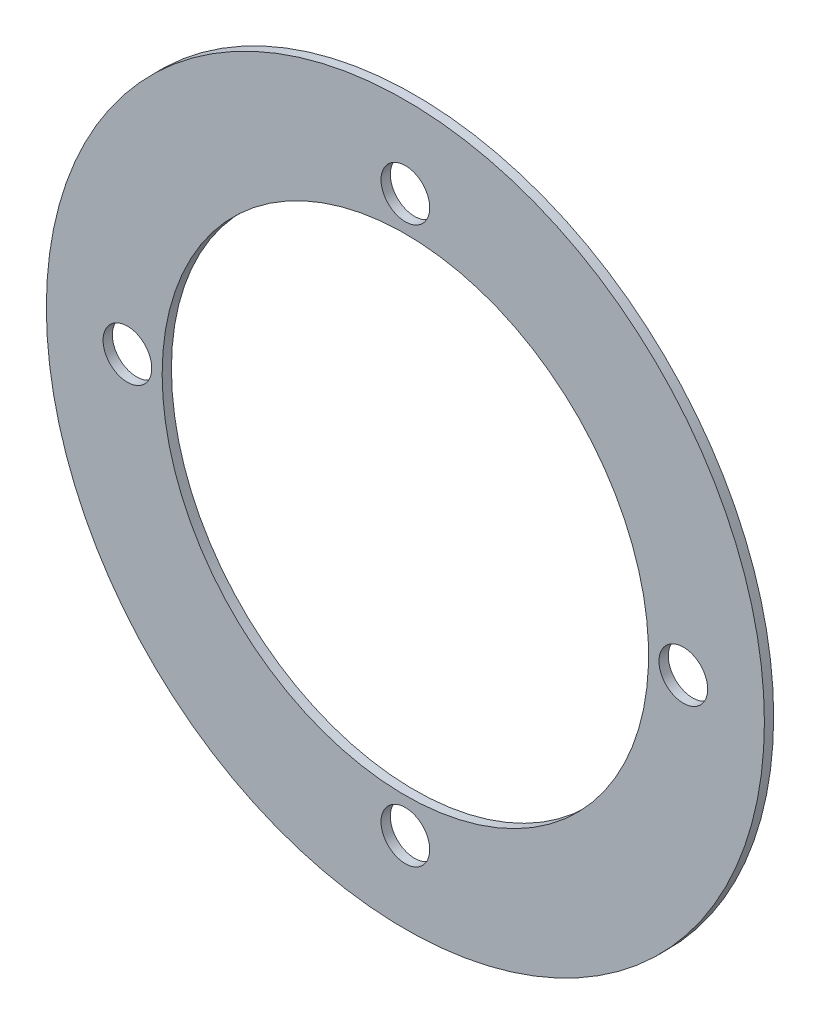
ISO-10303-21;
HEADER;
FILE_DESCRIPTION(('STEP AP214'),'2;1');
FILE_NAME('part.step','',(''),(''),'','','');
FILE_SCHEMA(('AUTOMOTIVE_DESIGN { 1 0 10303 214 1 1 1 1 }'));
ENDSEC;
DATA;
#1=APPLICATION_CONTEXT('core data for automotive mechanical design processes');
#2=APPLICATION_PROTOCOL_DEFINITION('international standard','automotive_design',2000,#1);
#3=PRODUCT_CONTEXT('',#1,'mechanical');
#4=PRODUCT('Part','Part','',(#3));
#5=PRODUCT_RELATED_PRODUCT_CATEGORY('part','',(#4));
#6=PRODUCT_DEFINITION_FORMATION('','',#4);
#7=PRODUCT_DEFINITION_CONTEXT('part definition',#1,'design');
#8=PRODUCT_DEFINITION('design','',#6,#7);
#9=PRODUCT_DEFINITION_SHAPE('','',#8);
#10=(LENGTH_UNIT() NAMED_UNIT(*) SI_UNIT(.MILLI.,.METRE.));
#11=(NAMED_UNIT(*) PLANE_ANGLE_UNIT() SI_UNIT($,.RADIAN.));
#12=(NAMED_UNIT(*) SI_UNIT($,.STERADIAN.) SOLID_ANGLE_UNIT());
#13=UNCERTAINTY_MEASURE_WITH_UNIT(LENGTH_MEASURE(1.E-05),#10,'distance_accuracy_value','');
#14=(GEOMETRIC_REPRESENTATION_CONTEXT(3) GLOBAL_UNCERTAINTY_ASSIGNED_CONTEXT((#13)) GLOBAL_UNIT_ASSIGNED_CONTEXT((#10,
#11,#12)) REPRESENTATION_CONTEXT('',''));
#15=CARTESIAN_POINT('',(0.,0.,0.));
#16=DIRECTION('',(0.,0.,1.));
#17=DIRECTION('',(1.,0.,0.));
#18=AXIS2_PLACEMENT_3D('',#15,#16,#17);
#19=CARTESIAN_POINT('',(0.,0.,0.8));
#20=DIRECTION('',(0.,0.,1.));
#21=DIRECTION('',(1.,0.,0.));
#22=AXIS2_PLACEMENT_3D('',#19,#20,#21);
#23=PLANE('',#22);
#24=CARTESIAN_POINT('',(-24.,2.51386801999876E-13,0.8));
#25=DIRECTION('',(0.,0.,-1.));
#26=DIRECTION('',(-1.,0.,0.));
#27=AXIS2_PLACEMENT_3D('',#24,#25,#26);
#28=CIRCLE('',#27,2.1);
#29=CARTESIAN_POINT('',(-26.1,2.51386801999876E-13,0.8));
#30=VERTEX_POINT('',#29);
#31=EDGE_CURVE('E41',#30,#30,#28,.T.);
#32=ORIENTED_EDGE('',*,*,#31,.T.);
#33=EDGE_LOOP('',(#32));
#34=FACE_BOUND('',#33,.T.);
#35=CARTESIAN_POINT('',(24.,0.,0.8));
#36=DIRECTION('',(0.,0.,-1.));
#37=DIRECTION('',(-1.,0.,0.));
#38=AXIS2_PLACEMENT_3D('',#35,#36,#37);
#39=CIRCLE('',#38,2.1);
#40=CARTESIAN_POINT('',(21.9,0.,0.8));
#41=VERTEX_POINT('',#40);
#42=EDGE_CURVE('E44',#41,#41,#39,.T.);
#43=ORIENTED_EDGE('',*,*,#42,.T.);
#44=EDGE_LOOP('',(#43));
#45=FACE_BOUND('',#44,.T.);
#46=CARTESIAN_POINT('',(0.,24.,0.8));
#47=DIRECTION('',(0.,0.,-1.));
#48=DIRECTION('',(-1.,0.,0.));
#49=AXIS2_PLACEMENT_3D('',#46,#47,#48);
#50=CIRCLE('',#49,2.1);
#51=CARTESIAN_POINT('',(-2.1,24.,0.8));
#52=VERTEX_POINT('',#51);
#53=EDGE_CURVE('E47',#52,#52,#50,.T.);
#54=ORIENTED_EDGE('',*,*,#53,.T.);
#55=EDGE_LOOP('',(#54));
#56=FACE_BOUND('',#55,.T.);
#57=CARTESIAN_POINT('',(0.,0.,0.8));
#58=DIRECTION('',(0.,0.,-1.));
#59=DIRECTION('',(-1.,0.,0.));
#60=AXIS2_PLACEMENT_3D('',#57,#58,#59);
#61=CIRCLE('',#60,31.);
#62=CARTESIAN_POINT('',(-31.,0.,0.8));
#63=VERTEX_POINT('',#62);
#64=EDGE_CURVE('E50',#63,#63,#61,.T.);
#65=ORIENTED_EDGE('',*,*,#64,.F.);
#66=EDGE_LOOP('',(#65));
#67=FACE_BOUND('',#66,.T.);
#68=CARTESIAN_POINT('',(0.,0.,0.8));
#69=DIRECTION('',(0.,0.,-1.));
#70=DIRECTION('',(-1.,0.,0.));
#71=AXIS2_PLACEMENT_3D('',#68,#69,#70);
#72=CIRCLE('',#71,21.);
#73=CARTESIAN_POINT('',(-21.,0.,0.8));
#74=VERTEX_POINT('',#73);
#75=EDGE_CURVE('E52',#74,#74,#72,.T.);
#76=ORIENTED_EDGE('',*,*,#75,.T.);
#77=EDGE_LOOP('',(#76));
#78=FACE_BOUND('',#77,.T.);
#79=CARTESIAN_POINT('',(6.76243012900129E-13,-24.,0.8));
#80=DIRECTION('',(0.,0.,-1.));
#81=DIRECTION('',(-1.,0.,0.));
#82=AXIS2_PLACEMENT_3D('',#79,#80,#81);
#83=CIRCLE('',#82,2.10000000000081);
#84=CARTESIAN_POINT('',(-2.10000000000013,-24.,0.8));
#85=VERTEX_POINT('',#84);
#86=EDGE_CURVE('E18',#85,#85,#83,.T.);
#87=ORIENTED_EDGE('',*,*,#86,.T.);
#88=EDGE_LOOP('',(#87));
#89=FACE_BOUND('',#88,.T.);
#90=ADVANCED_FACE('F15',(#34,#45,#56,#67,#78,#89),#23,.T.);
#91=CARTESIAN_POINT('',(6.76243012900129E-13,-24.,0.8));
#92=DIRECTION('',(0.,0.,-1.));
#93=DIRECTION('',(-1.,0.,0.));
#94=AXIS2_PLACEMENT_3D('',#91,#92,#93);
#95=CYLINDRICAL_SURFACE('',#94,2.10000000000081);
#96=CARTESIAN_POINT('',(6.76243012900129E-13,-24.,0.));
#97=DIRECTION('',(0.,0.,-1.));
#98=DIRECTION('',(-1.,0.,0.));
#99=AXIS2_PLACEMENT_3D('',#96,#97,#98);
#100=CIRCLE('',#99,2.10000000000081);
#101=CARTESIAN_POINT('',(-2.10000000000013,-24.,0.));
#102=VERTEX_POINT('',#101);
#103=EDGE_CURVE('E38',#102,#102,#100,.T.);
#104=ORIENTED_EDGE('',*,*,#103,.T.);
#105=EDGE_LOOP('',(#104));
#106=FACE_BOUND('',#105,.T.);
#107=ORIENTED_EDGE('',*,*,#86,.F.);
#108=EDGE_LOOP('',(#107));
#109=FACE_BOUND('',#108,.T.);
#110=ADVANCED_FACE('F60',(#106,#109),#95,.F.);
#111=CARTESIAN_POINT('',(0.,0.,0.8));
#112=DIRECTION('',(0.,0.,-1.));
#113=DIRECTION('',(-1.,0.,0.));
#114=AXIS2_PLACEMENT_3D('',#111,#112,#113);
#115=CYLINDRICAL_SURFACE('',#114,21.);
#116=CARTESIAN_POINT('',(0.,0.,0.));
#117=DIRECTION('',(0.,0.,-1.));
#118=DIRECTION('',(-1.,0.,0.));
#119=AXIS2_PLACEMENT_3D('',#116,#117,#118);
#120=CIRCLE('',#119,21.);
#121=CARTESIAN_POINT('',(-21.,0.,0.));
#122=VERTEX_POINT('',#121);
#123=EDGE_CURVE('E35',#122,#122,#120,.T.);
#124=ORIENTED_EDGE('',*,*,#123,.T.);
#125=EDGE_LOOP('',(#124));
#126=FACE_BOUND('',#125,.T.);
#127=ORIENTED_EDGE('',*,*,#75,.F.);
#128=EDGE_LOOP('',(#127));
#129=FACE_BOUND('',#128,.T.);
#130=ADVANCED_FACE('F62',(#126,#129),#115,.F.);
#131=CARTESIAN_POINT('',(0.,0.,0.8));
#132=DIRECTION('',(0.,0.,-1.));
#133=DIRECTION('',(-1.,0.,0.));
#134=AXIS2_PLACEMENT_3D('',#131,#132,#133);
#135=CYLINDRICAL_SURFACE('',#134,31.);
#136=ORIENTED_EDGE('',*,*,#64,.T.);
#137=EDGE_LOOP('',(#136));
#138=FACE_BOUND('',#137,.T.);
#139=CARTESIAN_POINT('',(0.,0.,0.));
#140=DIRECTION('',(0.,0.,-1.));
#141=DIRECTION('',(-1.,0.,0.));
#142=AXIS2_PLACEMENT_3D('',#139,#140,#141);
#143=CIRCLE('',#142,31.);
#144=CARTESIAN_POINT('',(-31.,0.,0.));
#145=VERTEX_POINT('',#144);
#146=EDGE_CURVE('E32',#145,#145,#143,.F.);
#147=ORIENTED_EDGE('',*,*,#146,.T.);
#148=EDGE_LOOP('',(#147));
#149=FACE_BOUND('',#148,.T.);
#150=ADVANCED_FACE('F69',(#138,#149),#135,.T.);
#151=CARTESIAN_POINT('',(0.,24.,0.8));
#152=DIRECTION('',(0.,0.,-1.));
#153=DIRECTION('',(-1.,0.,0.));
#154=AXIS2_PLACEMENT_3D('',#151,#152,#153);
#155=CYLINDRICAL_SURFACE('',#154,2.1);
#156=CARTESIAN_POINT('',(0.,24.,0.));
#157=DIRECTION('',(0.,0.,-1.));
#158=DIRECTION('',(-1.,0.,0.));
#159=AXIS2_PLACEMENT_3D('',#156,#157,#158);
#160=CIRCLE('',#159,2.1);
#161=CARTESIAN_POINT('',(-2.1,24.,0.));
#162=VERTEX_POINT('',#161);
#163=EDGE_CURVE('E27',#162,#162,#160,.T.);
#164=ORIENTED_EDGE('',*,*,#163,.T.);
#165=EDGE_LOOP('',(#164));
#166=FACE_BOUND('',#165,.T.);
#167=ORIENTED_EDGE('',*,*,#53,.F.);
#168=EDGE_LOOP('',(#167));
#169=FACE_BOUND('',#168,.T.);
#170=ADVANCED_FACE('F87',(#166,#169),#155,.F.);
#171=CARTESIAN_POINT('',(24.,0.,0.8));
#172=DIRECTION('',(0.,0.,-1.));
#173=DIRECTION('',(-1.,0.,0.));
#174=AXIS2_PLACEMENT_3D('',#171,#172,#173);
#175=CYLINDRICAL_SURFACE('',#174,2.1);
#176=CARTESIAN_POINT('',(24.,0.,0.));
#177=DIRECTION('',(0.,0.,-1.));
#178=DIRECTION('',(-1.,0.,0.));
#179=AXIS2_PLACEMENT_3D('',#176,#177,#178);
#180=CIRCLE('',#179,2.1);
#181=CARTESIAN_POINT('',(21.9,0.,0.));
#182=VERTEX_POINT('',#181);
#183=EDGE_CURVE('E22',#182,#182,#180,.T.);
#184=ORIENTED_EDGE('',*,*,#183,.T.);
#185=EDGE_LOOP('',(#184));
#186=FACE_BOUND('',#185,.T.);
#187=ORIENTED_EDGE('',*,*,#42,.F.);
#188=EDGE_LOOP('',(#187));
#189=FACE_BOUND('',#188,.T.);
#190=ADVANCED_FACE('F81',(#186,#189),#175,.F.);
#191=CARTESIAN_POINT('',(-24.,2.51386801999876E-13,0.8));
#192=DIRECTION('',(0.,0.,-1.));
#193=DIRECTION('',(-1.,0.,0.));
#194=AXIS2_PLACEMENT_3D('',#191,#192,#193);
#195=CYLINDRICAL_SURFACE('',#194,2.1);
#196=CARTESIAN_POINT('',(-24.,2.51386801999876E-13,0.));
#197=DIRECTION('',(0.,0.,-1.));
#198=DIRECTION('',(-1.,0.,0.));
#199=AXIS2_PLACEMENT_3D('',#196,#197,#198);
#200=CIRCLE('',#199,2.1);
#201=CARTESIAN_POINT('',(-26.1,2.51386801999876E-13,0.));
#202=VERTEX_POINT('',#201);
#203=EDGE_CURVE('E9',#202,#202,#200,.T.);
#204=ORIENTED_EDGE('',*,*,#203,.T.);
#205=EDGE_LOOP('',(#204));
#206=FACE_BOUND('',#205,.T.);
#207=ORIENTED_EDGE('',*,*,#31,.F.);
#208=EDGE_LOOP('',(#207));
#209=FACE_BOUND('',#208,.T.);
#210=ADVANCED_FACE('F75',(#206,#209),#195,.F.);
#211=CARTESIAN_POINT('',(0.,0.,0.));
#212=DIRECTION('',(0.,0.,1.));
#213=DIRECTION('',(1.,0.,0.));
#214=AXIS2_PLACEMENT_3D('',#211,#212,#213);
#215=PLANE('',#214);
#216=ORIENTED_EDGE('',*,*,#203,.F.);
#217=EDGE_LOOP('',(#216));
#218=FACE_BOUND('',#217,.T.);
#219=ORIENTED_EDGE('',*,*,#183,.F.);
#220=EDGE_LOOP('',(#219));
#221=FACE_BOUND('',#220,.T.);
#222=ORIENTED_EDGE('',*,*,#163,.F.);
#223=EDGE_LOOP('',(#222));
#224=FACE_BOUND('',#223,.T.);
#225=ORIENTED_EDGE('',*,*,#146,.F.);
#226=EDGE_LOOP('',(#225));
#227=FACE_BOUND('',#226,.T.);
#228=ORIENTED_EDGE('',*,*,#123,.F.);
#229=EDGE_LOOP('',(#228));
#230=FACE_BOUND('',#229,.T.);
#231=ORIENTED_EDGE('',*,*,#103,.F.);
#232=EDGE_LOOP('',(#231));
#233=FACE_BOUND('',#232,.T.);
#234=ADVANCED_FACE('F73',(#218,#221,#224,#227,#230,#233),#215,.F.);
#235=CLOSED_SHELL('',(#90,#110,#130,#150,#170,#190,#210,#234));
#236=MANIFOLD_SOLID_BREP('B1',#235);
#237=ADVANCED_BREP_SHAPE_REPRESENTATION('',(#18,#236),#14);
#238=SHAPE_DEFINITION_REPRESENTATION(#9,#237);
ENDSEC;
END-ISO-10303-21;
